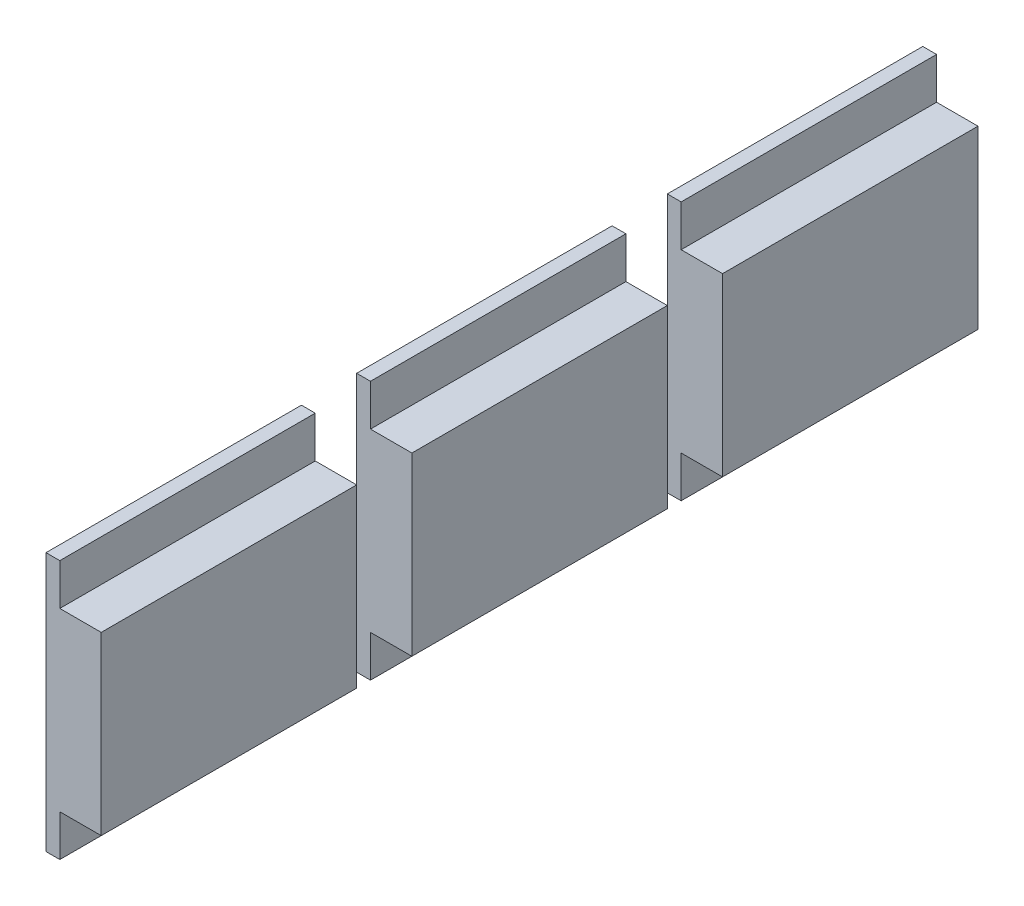
ISO-10303-21;
HEADER;
FILE_DESCRIPTION(('STEP AP214'),'2;1');
FILE_NAME('part.step','',(''),(''),'','','');
FILE_SCHEMA(('AUTOMOTIVE_DESIGN { 1 0 10303 214 1 1 1 1 }'));
ENDSEC;
DATA;
#1=APPLICATION_CONTEXT('core data for automotive mechanical design processes');
#2=APPLICATION_PROTOCOL_DEFINITION('international standard','automotive_design',2000,#1);
#3=PRODUCT_CONTEXT('',#1,'mechanical');
#4=PRODUCT('Part','Part','',(#3));
#5=PRODUCT_RELATED_PRODUCT_CATEGORY('part','',(#4));
#6=PRODUCT_DEFINITION_FORMATION('','',#4);
#7=PRODUCT_DEFINITION_CONTEXT('part definition',#1,'design');
#8=PRODUCT_DEFINITION('design','',#6,#7);
#9=PRODUCT_DEFINITION_SHAPE('','',#8);
#10=(LENGTH_UNIT() NAMED_UNIT(*) SI_UNIT(.MILLI.,.METRE.));
#11=(NAMED_UNIT(*) PLANE_ANGLE_UNIT() SI_UNIT($,.RADIAN.));
#12=(NAMED_UNIT(*) SI_UNIT($,.STERADIAN.) SOLID_ANGLE_UNIT());
#13=UNCERTAINTY_MEASURE_WITH_UNIT(LENGTH_MEASURE(1.E-05),#10,'distance_accuracy_value','');
#14=(GEOMETRIC_REPRESENTATION_CONTEXT(3) GLOBAL_UNCERTAINTY_ASSIGNED_CONTEXT((#13)) GLOBAL_UNIT_ASSIGNED_CONTEXT((#10,
#11,#12)) REPRESENTATION_CONTEXT('',''));
#15=CARTESIAN_POINT('',(0.,0.,0.));
#16=DIRECTION('',(0.,0.,1.));
#17=DIRECTION('',(1.,0.,0.));
#18=AXIS2_PLACEMENT_3D('',#15,#16,#17);
#19=CARTESIAN_POINT('',(87.8,0.,-18.));
#20=DIRECTION('',(1.,0.,0.));
#21=DIRECTION('',(0.,0.,-1.));
#22=AXIS2_PLACEMENT_3D('',#19,#20,#21);
#23=PLANE('',#22);
#24=DIRECTION('',(0.,0.,-1.));
#25=VECTOR('',#24,1.);
#26=CARTESIAN_POINT('',(87.8,10.55,-49.19));
#27=LINE('',#26,#25);
#28=CARTESIAN_POINT('',(87.8,10.55,-49.19));
#29=VERTEX_POINT('',#28);
#30=CARTESIAN_POINT('',(87.8,10.55,-56.59));
#31=VERTEX_POINT('',#30);
#32=EDGE_CURVE('E69',#29,#31,#27,.T.);
#33=ORIENTED_EDGE('',*,*,#32,.F.);
#34=DIRECTION('',(0.,-1.,0.));
#35=VECTOR('',#34,1.);
#36=CARTESIAN_POINT('',(87.8,16.85,-49.19));
#37=LINE('',#36,#35);
#38=CARTESIAN_POINT('',(87.8,9.34999999999999,-49.19));
#39=VERTEX_POINT('',#38);
#40=EDGE_CURVE('E164',#29,#39,#37,.T.);
#41=ORIENTED_EDGE('',*,*,#40,.T.);
#42=DIRECTION('',(0.,0.,-1.));
#43=VECTOR('',#42,1.);
#44=CARTESIAN_POINT('',(87.8,9.34999999999999,-49.19));
#45=LINE('',#44,#43);
#46=CARTESIAN_POINT('',(87.8,9.34999999999999,-56.59));
#47=VERTEX_POINT('',#46);
#48=EDGE_CURVE('E152',#39,#47,#45,.T.);
#49=ORIENTED_EDGE('',*,*,#48,.T.);
#50=DIRECTION('',(0.,1.,0.));
#51=VECTOR('',#50,1.);
#52=CARTESIAN_POINT('',(87.8,9.34999999999999,-56.59));
#53=LINE('',#52,#51);
#54=EDGE_CURVE('E142',#47,#31,#53,.T.);
#55=ORIENTED_EDGE('',*,*,#54,.T.);
#56=EDGE_LOOP('',(#33,#41,#49,#55));
#57=FACE_BOUND('',#56,.T.);
#58=ADVANCED_FACE('F52',(#57),#23,.T.);
#59=CARTESIAN_POINT('',(87.4,9.34999999999999,-56.59));
#60=DIRECTION('',(0.,0.,-1.));
#61=DIRECTION('',(-1.,0.,0.));
#62=AXIS2_PLACEMENT_3D('',#59,#60,#61);
#63=PLANE('',#62);
#64=ORIENTED_EDGE('',*,*,#54,.F.);
#65=DIRECTION('',(1.,0.,0.));
#66=VECTOR('',#65,1.);
#67=CARTESIAN_POINT('',(87.4,9.34999999999999,-56.59));
#68=LINE('',#67,#66);
#69=CARTESIAN_POINT('',(87.4,9.34999999999999,-56.59));
#70=VERTEX_POINT('',#69);
#71=EDGE_CURVE('E12',#70,#47,#68,.T.);
#72=ORIENTED_EDGE('',*,*,#71,.F.);
#73=DIRECTION('',(0.,1.,0.));
#74=VECTOR('',#73,1.);
#75=CARTESIAN_POINT('',(87.4,9.34999999999999,-56.59));
#76=LINE('',#75,#74);
#77=CARTESIAN_POINT('',(87.4,16.85,-56.59));
#78=VERTEX_POINT('',#77);
#79=EDGE_CURVE('E148',#70,#78,#76,.T.);
#80=ORIENTED_EDGE('',*,*,#79,.T.);
#81=DIRECTION('',(1.,0.,0.));
#82=VECTOR('',#81,1.);
#83=CARTESIAN_POINT('',(87.4,16.85,-56.59));
#84=LINE('',#83,#82);
#85=CARTESIAN_POINT('',(87.8,16.85,-56.59));
#86=VERTEX_POINT('',#85);
#87=EDGE_CURVE('E56',#78,#86,#84,.T.);
#88=ORIENTED_EDGE('',*,*,#87,.T.);
#89=CARTESIAN_POINT('',(87.8,15.65,-56.59));
#90=VERTEX_POINT('',#89);
#91=EDGE_CURVE('E140',#90,#86,#53,.T.);
#92=ORIENTED_EDGE('',*,*,#91,.F.);
#93=DIRECTION('',(-1.,0.,0.));
#94=VECTOR('',#93,1.);
#95=CARTESIAN_POINT('',(89.,15.65,-56.59));
#96=LINE('',#95,#94);
#97=CARTESIAN_POINT('',(89.,15.65,-56.59));
#98=VERTEX_POINT('',#97);
#99=EDGE_CURVE('E122',#98,#90,#96,.T.);
#100=ORIENTED_EDGE('',*,*,#99,.F.);
#101=DIRECTION('',(0.,1.,0.));
#102=VECTOR('',#101,1.);
#103=CARTESIAN_POINT('',(89.,10.55,-56.59));
#104=LINE('',#103,#102);
#105=CARTESIAN_POINT('',(89.,10.55,-56.59));
#106=VERTEX_POINT('',#105);
#107=EDGE_CURVE('E128',#106,#98,#104,.T.);
#108=ORIENTED_EDGE('',*,*,#107,.F.);
#109=DIRECTION('',(-1.,0.,0.));
#110=VECTOR('',#109,1.);
#111=CARTESIAN_POINT('',(89.,10.55,-56.59));
#112=LINE('',#111,#110);
#113=EDGE_CURVE('E184',#106,#31,#112,.T.);
#114=ORIENTED_EDGE('',*,*,#113,.T.);
#115=EDGE_LOOP('',(#64,#72,#80,#88,#92,#100,#108,#114));
#116=FACE_BOUND('',#115,.T.);
#117=ADVANCED_FACE('F54',(#116),#63,.T.);
#118=CARTESIAN_POINT('',(87.4,9.34999999999999,-49.19));
#119=DIRECTION('',(0.,-1.,0.));
#120=DIRECTION('',(0.,0.,-1.));
#121=AXIS2_PLACEMENT_3D('',#118,#119,#120);
#122=PLANE('',#121);
#123=ORIENTED_EDGE('',*,*,#48,.F.);
#124=DIRECTION('',(1.,0.,0.));
#125=VECTOR('',#124,1.);
#126=CARTESIAN_POINT('',(87.4,9.34999999999999,-49.19));
#127=LINE('',#126,#125);
#128=CARTESIAN_POINT('',(87.4,9.34999999999999,-49.19));
#129=VERTEX_POINT('',#128);
#130=EDGE_CURVE('E61',#129,#39,#127,.T.);
#131=ORIENTED_EDGE('',*,*,#130,.F.);
#132=DIRECTION('',(0.,0.,-1.));
#133=VECTOR('',#132,1.);
#134=CARTESIAN_POINT('',(87.4,9.34999999999999,-49.19));
#135=LINE('',#134,#133);
#136=EDGE_CURVE('E158',#129,#70,#135,.T.);
#137=ORIENTED_EDGE('',*,*,#136,.T.);
#138=ORIENTED_EDGE('',*,*,#71,.T.);
#139=EDGE_LOOP('',(#123,#131,#137,#138));
#140=FACE_BOUND('',#139,.T.);
#141=ADVANCED_FACE('F192',(#140),#122,.T.);
#142=CARTESIAN_POINT('',(87.4,16.85,-49.19));
#143=DIRECTION('',(0.,0.,1.));
#144=DIRECTION('',(1.,0.,0.));
#145=AXIS2_PLACEMENT_3D('',#142,#143,#144);
#146=PLANE('',#145);
#147=CARTESIAN_POINT('',(87.8,16.85,-49.19));
#148=VERTEX_POINT('',#147);
#149=CARTESIAN_POINT('',(87.8,15.65,-49.19));
#150=VERTEX_POINT('',#149);
#151=EDGE_CURVE('E165',#148,#150,#37,.T.);
#152=ORIENTED_EDGE('',*,*,#151,.F.);
#153=DIRECTION('',(1.,0.,0.));
#154=VECTOR('',#153,1.);
#155=CARTESIAN_POINT('',(87.4,16.85,-49.19));
#156=LINE('',#155,#154);
#157=CARTESIAN_POINT('',(87.4,16.85,-49.19));
#158=VERTEX_POINT('',#157);
#159=EDGE_CURVE('E170',#158,#148,#156,.T.);
#160=ORIENTED_EDGE('',*,*,#159,.F.);
#161=DIRECTION('',(0.,-1.,0.));
#162=VECTOR('',#161,1.);
#163=CARTESIAN_POINT('',(87.4,16.85,-49.19));
#164=LINE('',#163,#162);
#165=EDGE_CURVE('E155',#158,#129,#164,.T.);
#166=ORIENTED_EDGE('',*,*,#165,.T.);
#167=ORIENTED_EDGE('',*,*,#130,.T.);
#168=ORIENTED_EDGE('',*,*,#40,.F.);
#169=DIRECTION('',(-1.,0.,0.));
#170=VECTOR('',#169,1.);
#171=CARTESIAN_POINT('',(89.,10.55,-49.19));
#172=LINE('',#171,#170);
#173=CARTESIAN_POINT('',(89.,10.55,-49.19));
#174=VERTEX_POINT('',#173);
#175=EDGE_CURVE('E144',#174,#29,#172,.T.);
#176=ORIENTED_EDGE('',*,*,#175,.F.);
#177=DIRECTION('',(0.,-1.,0.));
#178=VECTOR('',#177,1.);
#179=CARTESIAN_POINT('',(89.,15.65,-49.19));
#180=LINE('',#179,#178);
#181=CARTESIAN_POINT('',(89.,15.65,-49.19));
#182=VERTEX_POINT('',#181);
#183=EDGE_CURVE('E127',#182,#174,#180,.T.);
#184=ORIENTED_EDGE('',*,*,#183,.F.);
#185=DIRECTION('',(-1.,0.,0.));
#186=VECTOR('',#185,1.);
#187=CARTESIAN_POINT('',(89.,15.65,-49.19));
#188=LINE('',#187,#186);
#189=EDGE_CURVE('E124',#182,#150,#188,.T.);
#190=ORIENTED_EDGE('',*,*,#189,.T.);
#191=EDGE_LOOP('',(#152,#160,#166,#167,#168,#176,#184,#190));
#192=FACE_BOUND('',#191,.T.);
#193=ADVANCED_FACE('F180',(#192),#146,.T.);
#194=CARTESIAN_POINT('',(87.4,16.85,-56.59));
#195=DIRECTION('',(0.,1.,0.));
#196=DIRECTION('',(0.,0.,1.));
#197=AXIS2_PLACEMENT_3D('',#194,#195,#196);
#198=PLANE('',#197);
#199=DIRECTION('',(0.,0.,1.));
#200=VECTOR('',#199,1.);
#201=CARTESIAN_POINT('',(87.8,16.85,-56.59));
#202=LINE('',#201,#200);
#203=EDGE_CURVE('E161',#86,#148,#202,.T.);
#204=ORIENTED_EDGE('',*,*,#203,.F.);
#205=ORIENTED_EDGE('',*,*,#87,.F.);
#206=DIRECTION('',(0.,0.,1.));
#207=VECTOR('',#206,1.);
#208=CARTESIAN_POINT('',(87.4,16.85,-56.59));
#209=LINE('',#208,#207);
#210=EDGE_CURVE('E151',#78,#158,#209,.T.);
#211=ORIENTED_EDGE('',*,*,#210,.T.);
#212=ORIENTED_EDGE('',*,*,#159,.T.);
#213=EDGE_LOOP('',(#204,#205,#211,#212));
#214=FACE_BOUND('',#213,.T.);
#215=ADVANCED_FACE('F176',(#214),#198,.T.);
#216=CARTESIAN_POINT('',(87.4,0.,-18.));
#217=DIRECTION('',(1.,0.,0.));
#218=DIRECTION('',(0.,0.,-1.));
#219=AXIS2_PLACEMENT_3D('',#216,#217,#218);
#220=PLANE('',#219);
#221=ORIENTED_EDGE('',*,*,#79,.F.);
#222=ORIENTED_EDGE('',*,*,#136,.F.);
#223=ORIENTED_EDGE('',*,*,#165,.F.);
#224=ORIENTED_EDGE('',*,*,#210,.F.);
#225=EDGE_LOOP('',(#221,#222,#223,#224));
#226=FACE_BOUND('',#225,.T.);
#227=ADVANCED_FACE('F196',(#226),#220,.F.);
#228=DIRECTION('',(0.,0.,1.));
#229=VECTOR('',#228,1.);
#230=CARTESIAN_POINT('',(87.8,15.65,-56.59));
#231=LINE('',#230,#229);
#232=EDGE_CURVE('E77',#90,#150,#231,.T.);
#233=ORIENTED_EDGE('',*,*,#232,.F.);
#234=ORIENTED_EDGE('',*,*,#91,.T.);
#235=ORIENTED_EDGE('',*,*,#203,.T.);
#236=ORIENTED_EDGE('',*,*,#151,.T.);
#237=EDGE_LOOP('',(#233,#234,#235,#236));
#238=FACE_BOUND('',#237,.T.);
#239=ADVANCED_FACE('F177',(#238),#23,.T.);
#240=CARTESIAN_POINT('',(89.,15.65,-56.59));
#241=DIRECTION('',(0.,-1.,0.));
#242=DIRECTION('',(0.,0.,-1.));
#243=AXIS2_PLACEMENT_3D('',#240,#241,#242);
#244=PLANE('',#243);
#245=ORIENTED_EDGE('',*,*,#232,.T.);
#246=ORIENTED_EDGE('',*,*,#189,.F.);
#247=DIRECTION('',(0.,0.,1.));
#248=VECTOR('',#247,1.);
#249=CARTESIAN_POINT('',(89.,15.65,-56.59));
#250=LINE('',#249,#248);
#251=EDGE_CURVE('E118',#98,#182,#250,.T.);
#252=ORIENTED_EDGE('',*,*,#251,.F.);
#253=ORIENTED_EDGE('',*,*,#99,.T.);
#254=EDGE_LOOP('',(#245,#246,#252,#253));
#255=FACE_BOUND('',#254,.T.);
#256=ADVANCED_FACE('F120',(#255),#244,.F.);
#257=CARTESIAN_POINT('',(89.,10.55,-49.19));
#258=DIRECTION('',(0.,1.,0.));
#259=DIRECTION('',(0.,0.,1.));
#260=AXIS2_PLACEMENT_3D('',#257,#258,#259);
#261=PLANE('',#260);
#262=ORIENTED_EDGE('',*,*,#32,.T.);
#263=ORIENTED_EDGE('',*,*,#113,.F.);
#264=DIRECTION('',(0.,0.,-1.));
#265=VECTOR('',#264,1.);
#266=CARTESIAN_POINT('',(89.,10.55,-49.19));
#267=LINE('',#266,#265);
#268=EDGE_CURVE('E133',#174,#106,#267,.T.);
#269=ORIENTED_EDGE('',*,*,#268,.F.);
#270=ORIENTED_EDGE('',*,*,#175,.T.);
#271=EDGE_LOOP('',(#262,#263,#269,#270));
#272=FACE_BOUND('',#271,.T.);
#273=ADVANCED_FACE('F189',(#272),#261,.F.);
#274=CARTESIAN_POINT('',(89.,0.,-18.));
#275=DIRECTION('',(1.,0.,0.));
#276=DIRECTION('',(0.,0.,-1.));
#277=AXIS2_PLACEMENT_3D('',#274,#275,#276);
#278=PLANE('',#277);
#279=ORIENTED_EDGE('',*,*,#107,.T.);
#280=ORIENTED_EDGE('',*,*,#251,.T.);
#281=ORIENTED_EDGE('',*,*,#183,.T.);
#282=ORIENTED_EDGE('',*,*,#268,.T.);
#283=EDGE_LOOP('',(#279,#280,#281,#282));
#284=FACE_BOUND('',#283,.T.);
#285=ADVANCED_FACE('F131',(#284),#278,.T.);
#286=CLOSED_SHELL('',(#58,#117,#141,#193,#215,#227,#239,#256,#273,#285));
#287=MANIFOLD_SOLID_BREP('B2',#286);
#288=CARTESIAN_POINT('',(87.8,0.,-9.));
#289=DIRECTION('',(1.,0.,0.));
#290=DIRECTION('',(0.,0.,-1.));
#291=AXIS2_PLACEMENT_3D('',#288,#289,#290);
#292=PLANE('',#291);
#293=DIRECTION('',(0.,0.,-1.));
#294=VECTOR('',#293,1.);
#295=CARTESIAN_POINT('',(87.8,10.55,-40.19));
#296=LINE('',#295,#294);
#297=CARTESIAN_POINT('',(87.8,10.55,-40.19));
#298=VERTEX_POINT('',#297);
#299=CARTESIAN_POINT('',(87.8,10.55,-47.59));
#300=VERTEX_POINT('',#299);
#301=EDGE_CURVE('E310',#298,#300,#296,.T.);
#302=ORIENTED_EDGE('',*,*,#301,.F.);
#303=DIRECTION('',(0.,-1.,0.));
#304=VECTOR('',#303,1.);
#305=CARTESIAN_POINT('',(87.8,16.85,-40.19));
#306=LINE('',#305,#304);
#307=CARTESIAN_POINT('',(87.8,9.34999999999999,-40.19));
#308=VERTEX_POINT('',#307);
#309=EDGE_CURVE('E405',#298,#308,#306,.T.);
#310=ORIENTED_EDGE('',*,*,#309,.T.);
#311=DIRECTION('',(0.,0.,-1.));
#312=VECTOR('',#311,1.);
#313=CARTESIAN_POINT('',(87.8,9.34999999999999,-40.19));
#314=LINE('',#313,#312);
#315=CARTESIAN_POINT('',(87.8,9.34999999999999,-47.59));
#316=VERTEX_POINT('',#315);
#317=EDGE_CURVE('E393',#308,#316,#314,.T.);
#318=ORIENTED_EDGE('',*,*,#317,.T.);
#319=DIRECTION('',(0.,1.,0.));
#320=VECTOR('',#319,1.);
#321=CARTESIAN_POINT('',(87.8,9.34999999999999,-47.59));
#322=LINE('',#321,#320);
#323=EDGE_CURVE('E383',#316,#300,#322,.T.);
#324=ORIENTED_EDGE('',*,*,#323,.T.);
#325=EDGE_LOOP('',(#302,#310,#318,#324));
#326=FACE_BOUND('',#325,.T.);
#327=ADVANCED_FACE('F293',(#326),#292,.T.);
#328=CARTESIAN_POINT('',(87.4,9.34999999999999,-47.59));
#329=DIRECTION('',(0.,0.,-1.));
#330=DIRECTION('',(-1.,0.,0.));
#331=AXIS2_PLACEMENT_3D('',#328,#329,#330);
#332=PLANE('',#331);
#333=ORIENTED_EDGE('',*,*,#323,.F.);
#334=DIRECTION('',(1.,0.,0.));
#335=VECTOR('',#334,1.);
#336=CARTESIAN_POINT('',(87.4,9.34999999999999,-47.59));
#337=LINE('',#336,#335);
#338=CARTESIAN_POINT('',(87.4,9.34999999999999,-47.59));
#339=VERTEX_POINT('',#338);
#340=EDGE_CURVE('E50',#339,#316,#337,.T.);
#341=ORIENTED_EDGE('',*,*,#340,.F.);
#342=DIRECTION('',(0.,1.,0.));
#343=VECTOR('',#342,1.);
#344=CARTESIAN_POINT('',(87.4,9.34999999999999,-47.59));
#345=LINE('',#344,#343);
#346=CARTESIAN_POINT('',(87.4,16.85,-47.59));
#347=VERTEX_POINT('',#346);
#348=EDGE_CURVE('E389',#339,#347,#345,.T.);
#349=ORIENTED_EDGE('',*,*,#348,.T.);
#350=DIRECTION('',(1.,0.,0.));
#351=VECTOR('',#350,1.);
#352=CARTESIAN_POINT('',(87.4,16.85,-47.59));
#353=LINE('',#352,#351);
#354=CARTESIAN_POINT('',(87.8,16.85,-47.59));
#355=VERTEX_POINT('',#354);
#356=EDGE_CURVE('E297',#347,#355,#353,.T.);
#357=ORIENTED_EDGE('',*,*,#356,.T.);
#358=CARTESIAN_POINT('',(87.8,15.65,-47.59));
#359=VERTEX_POINT('',#358);
#360=EDGE_CURVE('E381',#359,#355,#322,.T.);
#361=ORIENTED_EDGE('',*,*,#360,.F.);
#362=DIRECTION('',(-1.,0.,0.));
#363=VECTOR('',#362,1.);
#364=CARTESIAN_POINT('',(89.,15.65,-47.59));
#365=LINE('',#364,#363);
#366=CARTESIAN_POINT('',(89.,15.65,-47.59));
#367=VERTEX_POINT('',#366);
#368=EDGE_CURVE('E363',#367,#359,#365,.T.);
#369=ORIENTED_EDGE('',*,*,#368,.F.);
#370=DIRECTION('',(0.,1.,0.));
#371=VECTOR('',#370,1.);
#372=CARTESIAN_POINT('',(89.,10.55,-47.59));
#373=LINE('',#372,#371);
#374=CARTESIAN_POINT('',(89.,10.55,-47.59));
#375=VERTEX_POINT('',#374);
#376=EDGE_CURVE('E369',#375,#367,#373,.T.);
#377=ORIENTED_EDGE('',*,*,#376,.F.);
#378=DIRECTION('',(-1.,0.,0.));
#379=VECTOR('',#378,1.);
#380=CARTESIAN_POINT('',(89.,10.55,-47.59));
#381=LINE('',#380,#379);
#382=EDGE_CURVE('E425',#375,#300,#381,.T.);
#383=ORIENTED_EDGE('',*,*,#382,.T.);
#384=EDGE_LOOP('',(#333,#341,#349,#357,#361,#369,#377,#383));
#385=FACE_BOUND('',#384,.T.);
#386=ADVANCED_FACE('F295',(#385),#332,.T.);
#387=CARTESIAN_POINT('',(87.4,9.34999999999999,-40.19));
#388=DIRECTION('',(0.,-1.,0.));
#389=DIRECTION('',(0.,0.,-1.));
#390=AXIS2_PLACEMENT_3D('',#387,#388,#389);
#391=PLANE('',#390);
#392=ORIENTED_EDGE('',*,*,#317,.F.);
#393=DIRECTION('',(1.,0.,0.));
#394=VECTOR('',#393,1.);
#395=CARTESIAN_POINT('',(87.4,9.34999999999999,-40.19));
#396=LINE('',#395,#394);
#397=CARTESIAN_POINT('',(87.4,9.34999999999999,-40.19));
#398=VERTEX_POINT('',#397);
#399=EDGE_CURVE('E302',#398,#308,#396,.T.);
#400=ORIENTED_EDGE('',*,*,#399,.F.);
#401=DIRECTION('',(0.,0.,-1.));
#402=VECTOR('',#401,1.);
#403=CARTESIAN_POINT('',(87.4,9.34999999999999,-40.19));
#404=LINE('',#403,#402);
#405=EDGE_CURVE('E399',#398,#339,#404,.T.);
#406=ORIENTED_EDGE('',*,*,#405,.T.);
#407=ORIENTED_EDGE('',*,*,#340,.T.);
#408=EDGE_LOOP('',(#392,#400,#406,#407));
#409=FACE_BOUND('',#408,.T.);
#410=ADVANCED_FACE('F433',(#409),#391,.T.);
#411=CARTESIAN_POINT('',(87.4,16.85,-40.19));
#412=DIRECTION('',(0.,0.,1.));
#413=DIRECTION('',(1.,0.,0.));
#414=AXIS2_PLACEMENT_3D('',#411,#412,#413);
#415=PLANE('',#414);
#416=CARTESIAN_POINT('',(87.8,16.85,-40.19));
#417=VERTEX_POINT('',#416);
#418=CARTESIAN_POINT('',(87.8,15.65,-40.19));
#419=VERTEX_POINT('',#418);
#420=EDGE_CURVE('E406',#417,#419,#306,.T.);
#421=ORIENTED_EDGE('',*,*,#420,.F.);
#422=DIRECTION('',(1.,0.,0.));
#423=VECTOR('',#422,1.);
#424=CARTESIAN_POINT('',(87.4,16.85,-40.19));
#425=LINE('',#424,#423);
#426=CARTESIAN_POINT('',(87.4,16.85,-40.19));
#427=VERTEX_POINT('',#426);
#428=EDGE_CURVE('E411',#427,#417,#425,.T.);
#429=ORIENTED_EDGE('',*,*,#428,.F.);
#430=DIRECTION('',(0.,-1.,0.));
#431=VECTOR('',#430,1.);
#432=CARTESIAN_POINT('',(87.4,16.85,-40.19));
#433=LINE('',#432,#431);
#434=EDGE_CURVE('E396',#427,#398,#433,.T.);
#435=ORIENTED_EDGE('',*,*,#434,.T.);
#436=ORIENTED_EDGE('',*,*,#399,.T.);
#437=ORIENTED_EDGE('',*,*,#309,.F.);
#438=DIRECTION('',(-1.,0.,0.));
#439=VECTOR('',#438,1.);
#440=CARTESIAN_POINT('',(89.,10.55,-40.19));
#441=LINE('',#440,#439);
#442=CARTESIAN_POINT('',(89.,10.55,-40.19));
#443=VERTEX_POINT('',#442);
#444=EDGE_CURVE('E385',#443,#298,#441,.T.);
#445=ORIENTED_EDGE('',*,*,#444,.F.);
#446=DIRECTION('',(0.,-1.,0.));
#447=VECTOR('',#446,1.);
#448=CARTESIAN_POINT('',(89.,15.65,-40.19));
#449=LINE('',#448,#447);
#450=CARTESIAN_POINT('',(89.,15.65,-40.19));
#451=VERTEX_POINT('',#450);
#452=EDGE_CURVE('E368',#451,#443,#449,.T.);
#453=ORIENTED_EDGE('',*,*,#452,.F.);
#454=DIRECTION('',(-1.,0.,0.));
#455=VECTOR('',#454,1.);
#456=CARTESIAN_POINT('',(89.,15.65,-40.19));
#457=LINE('',#456,#455);
#458=EDGE_CURVE('E365',#451,#419,#457,.T.);
#459=ORIENTED_EDGE('',*,*,#458,.T.);
#460=EDGE_LOOP('',(#421,#429,#435,#436,#437,#445,#453,#459));
#461=FACE_BOUND('',#460,.T.);
#462=ADVANCED_FACE('F421',(#461),#415,.T.);
#463=CARTESIAN_POINT('',(87.4,16.85,-47.59));
#464=DIRECTION('',(0.,1.,0.));
#465=DIRECTION('',(0.,0.,1.));
#466=AXIS2_PLACEMENT_3D('',#463,#464,#465);
#467=PLANE('',#466);
#468=DIRECTION('',(0.,0.,1.));
#469=VECTOR('',#468,1.);
#470=CARTESIAN_POINT('',(87.8,16.85,-47.59));
#471=LINE('',#470,#469);
#472=EDGE_CURVE('E402',#355,#417,#471,.T.);
#473=ORIENTED_EDGE('',*,*,#472,.F.);
#474=ORIENTED_EDGE('',*,*,#356,.F.);
#475=DIRECTION('',(0.,0.,1.));
#476=VECTOR('',#475,1.);
#477=CARTESIAN_POINT('',(87.4,16.85,-47.59));
#478=LINE('',#477,#476);
#479=EDGE_CURVE('E392',#347,#427,#478,.T.);
#480=ORIENTED_EDGE('',*,*,#479,.T.);
#481=ORIENTED_EDGE('',*,*,#428,.T.);
#482=EDGE_LOOP('',(#473,#474,#480,#481));
#483=FACE_BOUND('',#482,.T.);
#484=ADVANCED_FACE('F417',(#483),#467,.T.);
#485=CARTESIAN_POINT('',(87.4,0.,-9.));
#486=DIRECTION('',(1.,0.,0.));
#487=DIRECTION('',(0.,0.,-1.));
#488=AXIS2_PLACEMENT_3D('',#485,#486,#487);
#489=PLANE('',#488);
#490=ORIENTED_EDGE('',*,*,#348,.F.);
#491=ORIENTED_EDGE('',*,*,#405,.F.);
#492=ORIENTED_EDGE('',*,*,#434,.F.);
#493=ORIENTED_EDGE('',*,*,#479,.F.);
#494=EDGE_LOOP('',(#490,#491,#492,#493));
#495=FACE_BOUND('',#494,.T.);
#496=ADVANCED_FACE('F437',(#495),#489,.F.);
#497=DIRECTION('',(0.,0.,1.));
#498=VECTOR('',#497,1.);
#499=CARTESIAN_POINT('',(87.8,15.65,-47.59));
#500=LINE('',#499,#498);
#501=EDGE_CURVE('E318',#359,#419,#500,.T.);
#502=ORIENTED_EDGE('',*,*,#501,.F.);
#503=ORIENTED_EDGE('',*,*,#360,.T.);
#504=ORIENTED_EDGE('',*,*,#472,.T.);
#505=ORIENTED_EDGE('',*,*,#420,.T.);
#506=EDGE_LOOP('',(#502,#503,#504,#505));
#507=FACE_BOUND('',#506,.T.);
#508=ADVANCED_FACE('F418',(#507),#292,.T.);
#509=CARTESIAN_POINT('',(89.,15.65,-47.59));
#510=DIRECTION('',(0.,-1.,0.));
#511=DIRECTION('',(0.,0.,-1.));
#512=AXIS2_PLACEMENT_3D('',#509,#510,#511);
#513=PLANE('',#512);
#514=ORIENTED_EDGE('',*,*,#501,.T.);
#515=ORIENTED_EDGE('',*,*,#458,.F.);
#516=DIRECTION('',(0.,0.,1.));
#517=VECTOR('',#516,1.);
#518=CARTESIAN_POINT('',(89.,15.65,-47.59));
#519=LINE('',#518,#517);
#520=EDGE_CURVE('E359',#367,#451,#519,.T.);
#521=ORIENTED_EDGE('',*,*,#520,.F.);
#522=ORIENTED_EDGE('',*,*,#368,.T.);
#523=EDGE_LOOP('',(#514,#515,#521,#522));
#524=FACE_BOUND('',#523,.T.);
#525=ADVANCED_FACE('F361',(#524),#513,.F.);
#526=CARTESIAN_POINT('',(89.,10.55,-40.19));
#527=DIRECTION('',(0.,1.,0.));
#528=DIRECTION('',(0.,0.,1.));
#529=AXIS2_PLACEMENT_3D('',#526,#527,#528);
#530=PLANE('',#529);
#531=ORIENTED_EDGE('',*,*,#301,.T.);
#532=ORIENTED_EDGE('',*,*,#382,.F.);
#533=DIRECTION('',(0.,0.,-1.));
#534=VECTOR('',#533,1.);
#535=CARTESIAN_POINT('',(89.,10.55,-40.19));
#536=LINE('',#535,#534);
#537=EDGE_CURVE('E374',#443,#375,#536,.T.);
#538=ORIENTED_EDGE('',*,*,#537,.F.);
#539=ORIENTED_EDGE('',*,*,#444,.T.);
#540=EDGE_LOOP('',(#531,#532,#538,#539));
#541=FACE_BOUND('',#540,.T.);
#542=ADVANCED_FACE('F430',(#541),#530,.F.);
#543=CARTESIAN_POINT('',(89.,0.,-9.));
#544=DIRECTION('',(1.,0.,0.));
#545=DIRECTION('',(0.,0.,-1.));
#546=AXIS2_PLACEMENT_3D('',#543,#544,#545);
#547=PLANE('',#546);
#548=ORIENTED_EDGE('',*,*,#376,.T.);
#549=ORIENTED_EDGE('',*,*,#520,.T.);
#550=ORIENTED_EDGE('',*,*,#452,.T.);
#551=ORIENTED_EDGE('',*,*,#537,.T.);
#552=EDGE_LOOP('',(#548,#549,#550,#551));
#553=FACE_BOUND('',#552,.T.);
#554=ADVANCED_FACE('F372',(#553),#547,.T.);
#555=CLOSED_SHELL('',(#327,#386,#410,#462,#484,#496,#508,#525,#542,#554));
#556=MANIFOLD_SOLID_BREP('B6',#555);
#557=CARTESIAN_POINT('',(87.8,0.,0.));
#558=DIRECTION('',(1.,0.,0.));
#559=DIRECTION('',(0.,0.,-1.));
#560=AXIS2_PLACEMENT_3D('',#557,#558,#559);
#561=PLANE('',#560);
#562=DIRECTION('',(0.,0.,-1.));
#563=VECTOR('',#562,1.);
#564=CARTESIAN_POINT('',(87.8,10.55,-31.19));
#565=LINE('',#564,#563);
#566=CARTESIAN_POINT('',(87.8,10.55,-31.19));
#567=VERTEX_POINT('',#566);
#568=CARTESIAN_POINT('',(87.8,10.55,-38.59));
#569=VERTEX_POINT('',#568);
#570=EDGE_CURVE('E550',#567,#569,#565,.T.);
#571=ORIENTED_EDGE('',*,*,#570,.F.);
#572=DIRECTION('',(0.,-1.,0.));
#573=VECTOR('',#572,1.);
#574=CARTESIAN_POINT('',(87.8,16.85,-31.19));
#575=LINE('',#574,#573);
#576=CARTESIAN_POINT('',(87.8,9.34999999999999,-31.19));
#577=VERTEX_POINT('',#576);
#578=EDGE_CURVE('E645',#567,#577,#575,.T.);
#579=ORIENTED_EDGE('',*,*,#578,.T.);
#580=DIRECTION('',(0.,0.,-1.));
#581=VECTOR('',#580,1.);
#582=CARTESIAN_POINT('',(87.8,9.34999999999999,-31.19));
#583=LINE('',#582,#581);
#584=CARTESIAN_POINT('',(87.8,9.34999999999999,-38.59));
#585=VERTEX_POINT('',#584);
#586=EDGE_CURVE('E633',#577,#585,#583,.T.);
#587=ORIENTED_EDGE('',*,*,#586,.T.);
#588=DIRECTION('',(0.,1.,0.));
#589=VECTOR('',#588,1.);
#590=CARTESIAN_POINT('',(87.8,9.34999999999999,-38.59));
#591=LINE('',#590,#589);
#592=EDGE_CURVE('E623',#585,#569,#591,.T.);
#593=ORIENTED_EDGE('',*,*,#592,.T.);
#594=EDGE_LOOP('',(#571,#579,#587,#593));
#595=FACE_BOUND('',#594,.T.);
#596=ADVANCED_FACE('F533',(#595),#561,.T.);
#597=CARTESIAN_POINT('',(87.4,9.34999999999999,-38.59));
#598=DIRECTION('',(0.,0.,-1.));
#599=DIRECTION('',(-1.,0.,0.));
#600=AXIS2_PLACEMENT_3D('',#597,#598,#599);
#601=PLANE('',#600);
#602=ORIENTED_EDGE('',*,*,#592,.F.);
#603=DIRECTION('',(1.,0.,0.));
#604=VECTOR('',#603,1.);
#605=CARTESIAN_POINT('',(87.4,9.34999999999999,-38.59));
#606=LINE('',#605,#604);
#607=CARTESIAN_POINT('',(87.4,9.34999999999999,-38.59));
#608=VERTEX_POINT('',#607);
#609=EDGE_CURVE('E291',#608,#585,#606,.T.);
#610=ORIENTED_EDGE('',*,*,#609,.F.);
#611=DIRECTION('',(0.,1.,0.));
#612=VECTOR('',#611,1.);
#613=CARTESIAN_POINT('',(87.4,9.34999999999999,-38.59));
#614=LINE('',#613,#612);
#615=CARTESIAN_POINT('',(87.4,16.85,-38.59));
#616=VERTEX_POINT('',#615);
#617=EDGE_CURVE('E629',#608,#616,#614,.T.);
#618=ORIENTED_EDGE('',*,*,#617,.T.);
#619=DIRECTION('',(1.,0.,0.));
#620=VECTOR('',#619,1.);
#621=CARTESIAN_POINT('',(87.4,16.85,-38.59));
#622=LINE('',#621,#620);
#623=CARTESIAN_POINT('',(87.8,16.85,-38.59));
#624=VERTEX_POINT('',#623);
#625=EDGE_CURVE('E537',#616,#624,#622,.T.);
#626=ORIENTED_EDGE('',*,*,#625,.T.);
#627=CARTESIAN_POINT('',(87.8,15.65,-38.59));
#628=VERTEX_POINT('',#627);
#629=EDGE_CURVE('E621',#628,#624,#591,.T.);
#630=ORIENTED_EDGE('',*,*,#629,.F.);
#631=DIRECTION('',(-1.,0.,0.));
#632=VECTOR('',#631,1.);
#633=CARTESIAN_POINT('',(89.,15.65,-38.59));
#634=LINE('',#633,#632);
#635=CARTESIAN_POINT('',(89.,15.65,-38.59));
#636=VERTEX_POINT('',#635);
#637=EDGE_CURVE('E603',#636,#628,#634,.T.);
#638=ORIENTED_EDGE('',*,*,#637,.F.);
#639=DIRECTION('',(0.,1.,0.));
#640=VECTOR('',#639,1.);
#641=CARTESIAN_POINT('',(89.,10.55,-38.59));
#642=LINE('',#641,#640);
#643=CARTESIAN_POINT('',(89.,10.55,-38.59));
#644=VERTEX_POINT('',#643);
#645=EDGE_CURVE('E609',#644,#636,#642,.T.);
#646=ORIENTED_EDGE('',*,*,#645,.F.);
#647=DIRECTION('',(-1.,0.,0.));
#648=VECTOR('',#647,1.);
#649=CARTESIAN_POINT('',(89.,10.55,-38.59));
#650=LINE('',#649,#648);
#651=EDGE_CURVE('E665',#644,#569,#650,.T.);
#652=ORIENTED_EDGE('',*,*,#651,.T.);
#653=EDGE_LOOP('',(#602,#610,#618,#626,#630,#638,#646,#652));
#654=FACE_BOUND('',#653,.T.);
#655=ADVANCED_FACE('F535',(#654),#601,.T.);
#656=CARTESIAN_POINT('',(87.4,9.34999999999999,-31.19));
#657=DIRECTION('',(0.,-1.,0.));
#658=DIRECTION('',(0.,0.,-1.));
#659=AXIS2_PLACEMENT_3D('',#656,#657,#658);
#660=PLANE('',#659);
#661=ORIENTED_EDGE('',*,*,#586,.F.);
#662=DIRECTION('',(1.,0.,0.));
#663=VECTOR('',#662,1.);
#664=CARTESIAN_POINT('',(87.4,9.34999999999999,-31.19));
#665=LINE('',#664,#663);
#666=CARTESIAN_POINT('',(87.4,9.34999999999999,-31.19));
#667=VERTEX_POINT('',#666);
#668=EDGE_CURVE('E542',#667,#577,#665,.T.);
#669=ORIENTED_EDGE('',*,*,#668,.F.);
#670=DIRECTION('',(0.,0.,-1.));
#671=VECTOR('',#670,1.);
#672=CARTESIAN_POINT('',(87.4,9.34999999999999,-31.19));
#673=LINE('',#672,#671);
#674=EDGE_CURVE('E639',#667,#608,#673,.T.);
#675=ORIENTED_EDGE('',*,*,#674,.T.);
#676=ORIENTED_EDGE('',*,*,#609,.T.);
#677=EDGE_LOOP('',(#661,#669,#675,#676));
#678=FACE_BOUND('',#677,.T.);
#679=ADVANCED_FACE('F673',(#678),#660,.T.);
#680=CARTESIAN_POINT('',(87.4,16.85,-31.19));
#681=DIRECTION('',(0.,0.,1.));
#682=DIRECTION('',(1.,0.,0.));
#683=AXIS2_PLACEMENT_3D('',#680,#681,#682);
#684=PLANE('',#683);
#685=CARTESIAN_POINT('',(87.8,16.85,-31.19));
#686=VERTEX_POINT('',#685);
#687=CARTESIAN_POINT('',(87.8,15.65,-31.19));
#688=VERTEX_POINT('',#687);
#689=EDGE_CURVE('E646',#686,#688,#575,.T.);
#690=ORIENTED_EDGE('',*,*,#689,.F.);
#691=DIRECTION('',(1.,0.,0.));
#692=VECTOR('',#691,1.);
#693=CARTESIAN_POINT('',(87.4,16.85,-31.19));
#694=LINE('',#693,#692);
#695=CARTESIAN_POINT('',(87.4,16.85,-31.19));
#696=VERTEX_POINT('',#695);
#697=EDGE_CURVE('E651',#696,#686,#694,.T.);
#698=ORIENTED_EDGE('',*,*,#697,.F.);
#699=DIRECTION('',(0.,-1.,0.));
#700=VECTOR('',#699,1.);
#701=CARTESIAN_POINT('',(87.4,16.85,-31.19));
#702=LINE('',#701,#700);
#703=EDGE_CURVE('E636',#696,#667,#702,.T.);
#704=ORIENTED_EDGE('',*,*,#703,.T.);
#705=ORIENTED_EDGE('',*,*,#668,.T.);
#706=ORIENTED_EDGE('',*,*,#578,.F.);
#707=DIRECTION('',(-1.,0.,0.));
#708=VECTOR('',#707,1.);
#709=CARTESIAN_POINT('',(89.,10.55,-31.19));
#710=LINE('',#709,#708);
#711=CARTESIAN_POINT('',(89.,10.55,-31.19));
#712=VERTEX_POINT('',#711);
#713=EDGE_CURVE('E625',#712,#567,#710,.T.);
#714=ORIENTED_EDGE('',*,*,#713,.F.);
#715=DIRECTION('',(0.,-1.,0.));
#716=VECTOR('',#715,1.);
#717=CARTESIAN_POINT('',(89.,15.65,-31.19));
#718=LINE('',#717,#716);
#719=CARTESIAN_POINT('',(89.,15.65,-31.19));
#720=VERTEX_POINT('',#719);
#721=EDGE_CURVE('E608',#720,#712,#718,.T.);
#722=ORIENTED_EDGE('',*,*,#721,.F.);
#723=DIRECTION('',(-1.,0.,0.));
#724=VECTOR('',#723,1.);
#725=CARTESIAN_POINT('',(89.,15.65,-31.19));
#726=LINE('',#725,#724);
#727=EDGE_CURVE('E605',#720,#688,#726,.T.);
#728=ORIENTED_EDGE('',*,*,#727,.T.);
#729=EDGE_LOOP('',(#690,#698,#704,#705,#706,#714,#722,#728));
#730=FACE_BOUND('',#729,.T.);
#731=ADVANCED_FACE('F661',(#730),#684,.T.);
#732=CARTESIAN_POINT('',(87.4,16.85,-38.59));
#733=DIRECTION('',(0.,1.,0.));
#734=DIRECTION('',(0.,0.,1.));
#735=AXIS2_PLACEMENT_3D('',#732,#733,#734);
#736=PLANE('',#735);
#737=DIRECTION('',(0.,0.,1.));
#738=VECTOR('',#737,1.);
#739=CARTESIAN_POINT('',(87.8,16.85,-38.59));
#740=LINE('',#739,#738);
#741=EDGE_CURVE('E642',#624,#686,#740,.T.);
#742=ORIENTED_EDGE('',*,*,#741,.F.);
#743=ORIENTED_EDGE('',*,*,#625,.F.);
#744=DIRECTION('',(0.,0.,1.));
#745=VECTOR('',#744,1.);
#746=CARTESIAN_POINT('',(87.4,16.85,-38.59));
#747=LINE('',#746,#745);
#748=EDGE_CURVE('E632',#616,#696,#747,.T.);
#749=ORIENTED_EDGE('',*,*,#748,.T.);
#750=ORIENTED_EDGE('',*,*,#697,.T.);
#751=EDGE_LOOP('',(#742,#743,#749,#750));
#752=FACE_BOUND('',#751,.T.);
#753=ADVANCED_FACE('F657',(#752),#736,.T.);
#754=CARTESIAN_POINT('',(87.4,0.,0.));
#755=DIRECTION('',(1.,0.,0.));
#756=DIRECTION('',(0.,0.,-1.));
#757=AXIS2_PLACEMENT_3D('',#754,#755,#756);
#758=PLANE('',#757);
#759=ORIENTED_EDGE('',*,*,#617,.F.);
#760=ORIENTED_EDGE('',*,*,#674,.F.);
#761=ORIENTED_EDGE('',*,*,#703,.F.);
#762=ORIENTED_EDGE('',*,*,#748,.F.);
#763=EDGE_LOOP('',(#759,#760,#761,#762));
#764=FACE_BOUND('',#763,.T.);
#765=ADVANCED_FACE('F677',(#764),#758,.F.);
#766=DIRECTION('',(0.,0.,1.));
#767=VECTOR('',#766,1.);
#768=CARTESIAN_POINT('',(87.8,15.65,-38.59));
#769=LINE('',#768,#767);
#770=EDGE_CURVE('E558',#628,#688,#769,.T.);
#771=ORIENTED_EDGE('',*,*,#770,.F.);
#772=ORIENTED_EDGE('',*,*,#629,.T.);
#773=ORIENTED_EDGE('',*,*,#741,.T.);
#774=ORIENTED_EDGE('',*,*,#689,.T.);
#775=EDGE_LOOP('',(#771,#772,#773,#774));
#776=FACE_BOUND('',#775,.T.);
#777=ADVANCED_FACE('F658',(#776),#561,.T.);
#778=CARTESIAN_POINT('',(89.,15.65,-38.59));
#779=DIRECTION('',(0.,-1.,0.));
#780=DIRECTION('',(0.,0.,-1.));
#781=AXIS2_PLACEMENT_3D('',#778,#779,#780);
#782=PLANE('',#781);
#783=ORIENTED_EDGE('',*,*,#770,.T.);
#784=ORIENTED_EDGE('',*,*,#727,.F.);
#785=DIRECTION('',(0.,0.,1.));
#786=VECTOR('',#785,1.);
#787=CARTESIAN_POINT('',(89.,15.65,-38.59));
#788=LINE('',#787,#786);
#789=EDGE_CURVE('E599',#636,#720,#788,.T.);
#790=ORIENTED_EDGE('',*,*,#789,.F.);
#791=ORIENTED_EDGE('',*,*,#637,.T.);
#792=EDGE_LOOP('',(#783,#784,#790,#791));
#793=FACE_BOUND('',#792,.T.);
#794=ADVANCED_FACE('F601',(#793),#782,.F.);
#795=CARTESIAN_POINT('',(89.,10.55,-31.19));
#796=DIRECTION('',(0.,1.,0.));
#797=DIRECTION('',(0.,0.,1.));
#798=AXIS2_PLACEMENT_3D('',#795,#796,#797);
#799=PLANE('',#798);
#800=ORIENTED_EDGE('',*,*,#570,.T.);
#801=ORIENTED_EDGE('',*,*,#651,.F.);
#802=DIRECTION('',(0.,0.,-1.));
#803=VECTOR('',#802,1.);
#804=CARTESIAN_POINT('',(89.,10.55,-31.19));
#805=LINE('',#804,#803);
#806=EDGE_CURVE('E614',#712,#644,#805,.T.);
#807=ORIENTED_EDGE('',*,*,#806,.F.);
#808=ORIENTED_EDGE('',*,*,#713,.T.);
#809=EDGE_LOOP('',(#800,#801,#807,#808));
#810=FACE_BOUND('',#809,.T.);
#811=ADVANCED_FACE('F670',(#810),#799,.F.);
#812=CARTESIAN_POINT('',(89.,0.,0.));
#813=DIRECTION('',(1.,0.,0.));
#814=DIRECTION('',(0.,0.,-1.));
#815=AXIS2_PLACEMENT_3D('',#812,#813,#814);
#816=PLANE('',#815);
#817=ORIENTED_EDGE('',*,*,#645,.T.);
#818=ORIENTED_EDGE('',*,*,#789,.T.);
#819=ORIENTED_EDGE('',*,*,#721,.T.);
#820=ORIENTED_EDGE('',*,*,#806,.T.);
#821=EDGE_LOOP('',(#817,#818,#819,#820));
#822=FACE_BOUND('',#821,.T.);
#823=ADVANCED_FACE('F612',(#822),#816,.T.);
#824=CLOSED_SHELL('',(#596,#655,#679,#731,#753,#765,#777,#794,#811,#823));
#825=MANIFOLD_SOLID_BREP('B44',#824);
#826=ADVANCED_BREP_SHAPE_REPRESENTATION('',(#18,#287,#556,#825),#14);
#827=SHAPE_DEFINITION_REPRESENTATION(#9,#826);
ENDSEC;
END-ISO-10303-21;
